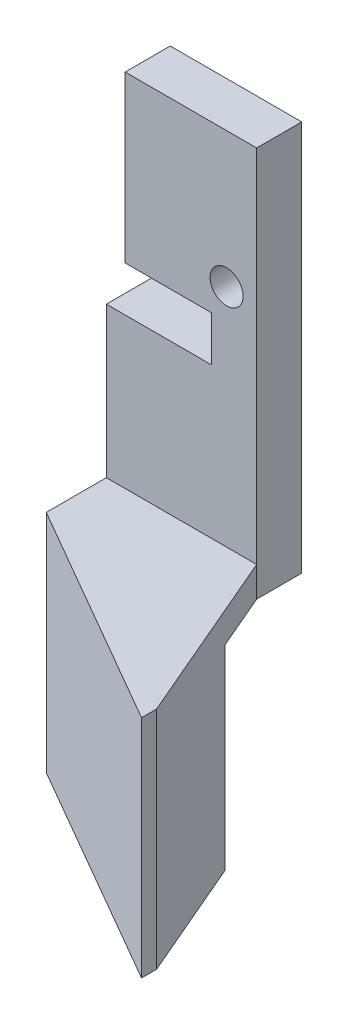
ISO-10303-21;
HEADER;
FILE_DESCRIPTION(('STEP AP214'),'2;1');
FILE_NAME('part.step','',(''),(''),'','','');
FILE_SCHEMA(('AUTOMOTIVE_DESIGN { 1 0 10303 214 1 1 1 1 }'));
ENDSEC;
DATA;
#1=APPLICATION_CONTEXT('core data for automotive mechanical design processes');
#2=APPLICATION_PROTOCOL_DEFINITION('international standard','automotive_design',2000,#1);
#3=PRODUCT_CONTEXT('',#1,'mechanical');
#4=PRODUCT('Part','Part','',(#3));
#5=PRODUCT_RELATED_PRODUCT_CATEGORY('part','',(#4));
#6=PRODUCT_DEFINITION_FORMATION('','',#4);
#7=PRODUCT_DEFINITION_CONTEXT('part definition',#1,'design');
#8=PRODUCT_DEFINITION('design','',#6,#7);
#9=PRODUCT_DEFINITION_SHAPE('','',#8);
#10=(LENGTH_UNIT() NAMED_UNIT(*) SI_UNIT(.MILLI.,.METRE.));
#11=(NAMED_UNIT(*) PLANE_ANGLE_UNIT() SI_UNIT($,.RADIAN.));
#12=(NAMED_UNIT(*) SI_UNIT($,.STERADIAN.) SOLID_ANGLE_UNIT());
#13=UNCERTAINTY_MEASURE_WITH_UNIT(LENGTH_MEASURE(1.E-05),#10,'distance_accuracy_value','');
#14=(GEOMETRIC_REPRESENTATION_CONTEXT(3) GLOBAL_UNCERTAINTY_ASSIGNED_CONTEXT((#13)) GLOBAL_UNIT_ASSIGNED_CONTEXT((#10,
#11,#12)) REPRESENTATION_CONTEXT('',''));
#15=CARTESIAN_POINT('',(0.,0.,0.));
#16=DIRECTION('',(0.,0.,1.));
#17=DIRECTION('',(1.,0.,0.));
#18=AXIS2_PLACEMENT_3D('',#15,#16,#17);
#19=CARTESIAN_POINT('',(4.875,0.,3.));
#20=DIRECTION('',(-1.,0.,0.));
#21=DIRECTION('',(0.,0.,1.));
#22=AXIS2_PLACEMENT_3D('',#19,#20,#21);
#23=PLANE('',#22);
#24=DIRECTION('',(0.,0.,1.));
#25=VECTOR('',#24,1.);
#26=CARTESIAN_POINT('',(4.875,-19.,0.));
#27=LINE('',#26,#25);
#28=CARTESIAN_POINT('',(4.875,-19.,0.));
#29=VERTEX_POINT('',#28);
#30=CARTESIAN_POINT('',(4.875,-19.,3.));
#31=VERTEX_POINT('',#30);
#32=EDGE_CURVE('E50',#29,#31,#27,.T.);
#33=ORIENTED_EDGE('',*,*,#32,.F.);
#34=DIRECTION('',(0.,1.,0.));
#35=VECTOR('',#34,1.);
#36=CARTESIAN_POINT('',(4.875,0.,0.));
#37=LINE('',#36,#35);
#38=CARTESIAN_POINT('',(4.875,7.,0.));
#39=VERTEX_POINT('',#38);
#40=EDGE_CURVE('E154',#29,#39,#37,.T.);
#41=ORIENTED_EDGE('',*,*,#40,.T.);
#42=DIRECTION('',(0.,0.,-1.));
#43=VECTOR('',#42,1.);
#44=CARTESIAN_POINT('',(4.875,7.,3.));
#45=LINE('',#44,#43);
#46=CARTESIAN_POINT('',(4.875,7.,3.));
#47=VERTEX_POINT('',#46);
#48=EDGE_CURVE('E211',#47,#39,#45,.T.);
#49=ORIENTED_EDGE('',*,*,#48,.F.);
#50=DIRECTION('',(0.,1.,0.));
#51=VECTOR('',#50,1.);
#52=CARTESIAN_POINT('',(4.875,0.,3.));
#53=LINE('',#52,#51);
#54=CARTESIAN_POINT('',(4.875,-17.,3.));
#55=VERTEX_POINT('',#54);
#56=EDGE_CURVE('E185',#55,#47,#53,.T.);
#57=ORIENTED_EDGE('',*,*,#56,.F.);
#58=DIRECTION('',(0.,1.,0.));
#59=VECTOR('',#58,1.);
#60=CARTESIAN_POINT('',(4.875,-32.,3.));
#61=LINE('',#60,#59);
#62=EDGE_CURVE('E235',#31,#55,#61,.T.);
#63=ORIENTED_EDGE('',*,*,#62,.F.);
#64=EDGE_LOOP('',(#33,#41,#49,#57,#63));
#65=FACE_BOUND('',#64,.T.);
#66=ADVANCED_FACE('F35',(#65),#23,.F.);
#67=CARTESIAN_POINT('',(0.,0.,0.));
#68=DIRECTION('',(0.,0.,1.));
#69=DIRECTION('',(1.,0.,0.));
#70=AXIS2_PLACEMENT_3D('',#67,#68,#69);
#71=PLANE('',#70);
#72=CARTESIAN_POINT('',(2.875,-2.,0.));
#73=DIRECTION('',(0.,0.,1.));
#74=DIRECTION('',(1.,0.,0.));
#75=AXIS2_PLACEMENT_3D('',#72,#73,#74);
#76=CIRCLE('',#75,1.1);
#77=CARTESIAN_POINT('',(3.975,-2.,0.));
#78=VERTEX_POINT('',#77);
#79=EDGE_CURVE('E173',#78,#78,#76,.T.);
#80=ORIENTED_EDGE('',*,*,#79,.T.);
#81=EDGE_LOOP('',(#80));
#82=FACE_BOUND('',#81,.T.);
#83=DIRECTION('',(1.,0.,0.));
#84=VECTOR('',#83,1.);
#85=CARTESIAN_POINT('',(0.,-19.,0.));
#86=LINE('',#85,#84);
#87=CARTESIAN_POINT('',(-5.125,-19.,0.));
#88=VERTEX_POINT('',#87);
#89=EDGE_CURVE('E144',#88,#29,#86,.T.);
#90=ORIENTED_EDGE('',*,*,#89,.F.);
#91=DIRECTION('',(0.,-1.,0.));
#92=VECTOR('',#91,1.);
#93=CARTESIAN_POINT('',(-5.125,-7.,0.));
#94=LINE('',#93,#92);
#95=CARTESIAN_POINT('',(-5.125,-7.,0.));
#96=VERTEX_POINT('',#95);
#97=EDGE_CURVE('E152',#96,#88,#94,.T.);
#98=ORIENTED_EDGE('',*,*,#97,.F.);
#99=DIRECTION('',(-1.,0.,0.));
#100=VECTOR('',#99,1.);
#101=CARTESIAN_POINT('',(4.875,-7.,0.));
#102=LINE('',#101,#100);
#103=CARTESIAN_POINT('',(1.875,-7.,0.));
#104=VERTEX_POINT('',#103);
#105=EDGE_CURVE('E161',#104,#96,#102,.T.);
#106=ORIENTED_EDGE('',*,*,#105,.F.);
#107=DIRECTION('',(0.,1.,0.));
#108=VECTOR('',#107,1.);
#109=CARTESIAN_POINT('',(1.875,0.,0.));
#110=LINE('',#109,#108);
#111=CARTESIAN_POINT('',(1.875,-4.,0.));
#112=VERTEX_POINT('',#111);
#113=EDGE_CURVE('E198',#104,#112,#110,.T.);
#114=ORIENTED_EDGE('',*,*,#113,.T.);
#115=DIRECTION('',(-1.,0.,0.));
#116=VECTOR('',#115,1.);
#117=CARTESIAN_POINT('',(0.,-4.,0.));
#118=LINE('',#117,#116);
#119=CARTESIAN_POINT('',(-3.875,-4.,0.));
#120=VERTEX_POINT('',#119);
#121=EDGE_CURVE('E195',#112,#120,#118,.T.);
#122=ORIENTED_EDGE('',*,*,#121,.T.);
#123=DIRECTION('',(0.,-1.,0.));
#124=VECTOR('',#123,1.);
#125=CARTESIAN_POINT('',(-3.875,0.,0.));
#126=LINE('',#125,#124);
#127=CARTESIAN_POINT('',(-3.875,7.,0.));
#128=VERTEX_POINT('',#127);
#129=EDGE_CURVE('E179',#128,#120,#126,.T.);
#130=ORIENTED_EDGE('',*,*,#129,.F.);
#131=DIRECTION('',(-1.,0.,0.));
#132=VECTOR('',#131,1.);
#133=CARTESIAN_POINT('',(0.,7.,0.));
#134=LINE('',#133,#132);
#135=EDGE_CURVE('E202',#39,#128,#134,.T.);
#136=ORIENTED_EDGE('',*,*,#135,.F.);
#137=ORIENTED_EDGE('',*,*,#40,.F.);
#138=EDGE_LOOP('',(#90,#98,#106,#114,#122,#130,#136,#137));
#139=FACE_BOUND('',#138,.T.);
#140=ADVANCED_FACE('F150',(#82,#139),#71,.F.);
#141=CARTESIAN_POINT('',(4.875,-32.,0.));
#142=DIRECTION('',(0.,-1.,0.));
#143=DIRECTION('',(0.,0.,-1.));
#144=AXIS2_PLACEMENT_3D('',#141,#142,#143);
#145=PLANE('',#144);
#146=DIRECTION('',(0.,0.,1.));
#147=VECTOR('',#146,1.);
#148=CARTESIAN_POINT('',(-5.125,-32.,0.));
#149=LINE('',#148,#147);
#150=CARTESIAN_POINT('',(-5.125,-32.,0.));
#151=VERTEX_POINT('',#150);
#152=CARTESIAN_POINT('',(-5.125,-32.,7.));
#153=VERTEX_POINT('',#152);
#154=EDGE_CURVE('E163',#151,#153,#149,.T.);
#155=ORIENTED_EDGE('',*,*,#154,.F.);
#156=DIRECTION('',(0.866025403784439,0.,0.5));
#157=VECTOR('',#156,1.);
#158=CARTESIAN_POINT('',(-1.28125,-32.,2.21919009719762));
#159=LINE('',#158,#157);
#160=CARTESIAN_POINT('',(6.45561311957995,-32.,6.68607010197039));
#161=VERTEX_POINT('',#160);
#162=EDGE_CURVE('E135',#151,#161,#159,.T.);
#163=ORIENTED_EDGE('',*,*,#162,.T.);
#164=DIRECTION('',(0.394102297208198,0.,0.91906658046913));
#165=VECTOR('',#164,1.);
#166=CARTESIAN_POINT('',(9.875,-32.,14.6602540378444));
#167=LINE('',#166,#165);
#168=CARTESIAN_POINT('',(9.875,-32.,14.6602540378444));
#169=VERTEX_POINT('',#168);
#170=EDGE_CURVE('E241',#161,#169,#167,.T.);
#171=ORIENTED_EDGE('',*,*,#170,.T.);
#172=DIRECTION('',(0.,0.,1.));
#173=VECTOR('',#172,1.);
#174=CARTESIAN_POINT('',(9.875,-32.,0.));
#175=LINE('',#174,#173);
#176=CARTESIAN_POINT('',(9.875,-32.,15.6602540378444));
#177=VERTEX_POINT('',#176);
#178=EDGE_CURVE('E246',#169,#177,#175,.T.);
#179=ORIENTED_EDGE('',*,*,#178,.T.);
#180=DIRECTION('',(0.866025403784438,0.,0.500000000000001));
#181=VECTOR('',#180,1.);
#182=CARTESIAN_POINT('',(-4.31233891324555,-32.,7.46919009719762));
#183=LINE('',#182,#181);
#184=EDGE_CURVE('E251',#153,#177,#183,.T.);
#185=ORIENTED_EDGE('',*,*,#184,.F.);
#186=EDGE_LOOP('',(#155,#163,#171,#179,#185));
#187=FACE_BOUND('',#186,.T.);
#188=ADVANCED_FACE('F284',(#187),#145,.T.);
#189=CARTESIAN_POINT('',(9.875,-32.,14.6602540378444));
#190=DIRECTION('',(-0.919066580469131,0.,0.394102297208198));
#191=DIRECTION('',(0.394102297208198,0.,0.919066580469131));
#192=AXIS2_PLACEMENT_3D('',#189,#190,#191);
#193=PLANE('',#192);
#194=DIRECTION('',(0.,-1.,0.));
#195=VECTOR('',#194,1.);
#196=CARTESIAN_POINT('',(6.45561311957995,-19.,6.68607010197039));
#197=LINE('',#196,#195);
#198=CARTESIAN_POINT('',(6.45561311957995,-19.,6.68607010197039));
#199=VERTEX_POINT('',#198);
#200=EDGE_CURVE('E139',#199,#161,#197,.T.);
#201=ORIENTED_EDGE('',*,*,#200,.F.);
#202=DIRECTION('',(0.394102297208199,0.,0.919066580469131));
#203=VECTOR('',#202,1.);
#204=CARTESIAN_POINT('',(3.0312127223087,-19.,-1.29980560992523));
#205=LINE('',#204,#203);
#206=EDGE_CURVE('E140',#31,#199,#205,.T.);
#207=ORIENTED_EDGE('',*,*,#206,.F.);
#208=ORIENTED_EDGE('',*,*,#62,.T.);
#209=DIRECTION('',(0.394102297208198,0.,0.91906658046913));
#210=VECTOR('',#209,1.);
#211=CARTESIAN_POINT('',(9.875,-17.,14.6602540378444));
#212=LINE('',#211,#210);
#213=CARTESIAN_POINT('',(9.875,-17.,14.6602540378444));
#214=VERTEX_POINT('',#213);
#215=EDGE_CURVE('E58',#55,#214,#212,.T.);
#216=ORIENTED_EDGE('',*,*,#215,.T.);
#217=DIRECTION('',(0.,1.,0.));
#218=VECTOR('',#217,1.);
#219=CARTESIAN_POINT('',(9.875,-32.,14.6602540378444));
#220=LINE('',#219,#218);
#221=EDGE_CURVE('E244',#169,#214,#220,.T.);
#222=ORIENTED_EDGE('',*,*,#221,.F.);
#223=ORIENTED_EDGE('',*,*,#170,.F.);
#224=EDGE_LOOP('',(#201,#207,#208,#216,#222,#223));
#225=FACE_BOUND('',#224,.T.);
#226=ADVANCED_FACE('F282',(#225),#193,.F.);
#227=CARTESIAN_POINT('',(0.,0.,3.));
#228=DIRECTION('',(0.,0.,1.));
#229=DIRECTION('',(1.,0.,0.));
#230=AXIS2_PLACEMENT_3D('',#227,#228,#229);
#231=PLANE('',#230);
#232=CARTESIAN_POINT('',(2.875,-2.,3.));
#233=DIRECTION('',(0.,0.,1.));
#234=DIRECTION('',(1.,0.,0.));
#235=AXIS2_PLACEMENT_3D('',#232,#233,#234);
#236=CIRCLE('',#235,1.1);
#237=CARTESIAN_POINT('',(3.975,-2.,3.));
#238=VERTEX_POINT('',#237);
#239=EDGE_CURVE('E175',#238,#238,#236,.T.);
#240=ORIENTED_EDGE('',*,*,#239,.F.);
#241=EDGE_LOOP('',(#240));
#242=FACE_BOUND('',#241,.T.);
#243=DIRECTION('',(0.,-1.,0.));
#244=VECTOR('',#243,1.);
#245=CARTESIAN_POINT('',(-5.125,-7.,3.));
#246=LINE('',#245,#244);
#247=CARTESIAN_POINT('',(-5.125,-7.,3.));
#248=VERTEX_POINT('',#247);
#249=CARTESIAN_POINT('',(-5.125,-17.,3.));
#250=VERTEX_POINT('',#249);
#251=EDGE_CURVE('E165',#248,#250,#246,.T.);
#252=ORIENTED_EDGE('',*,*,#251,.T.);
#253=DIRECTION('',(1.,0.,0.));
#254=VECTOR('',#253,1.);
#255=CARTESIAN_POINT('',(0.,-17.,3.));
#256=LINE('',#255,#254);
#257=EDGE_CURVE('E171',#250,#55,#256,.T.);
#258=ORIENTED_EDGE('',*,*,#257,.T.);
#259=ORIENTED_EDGE('',*,*,#56,.T.);
#260=DIRECTION('',(-1.,0.,0.));
#261=VECTOR('',#260,1.);
#262=CARTESIAN_POINT('',(0.,7.,3.));
#263=LINE('',#262,#261);
#264=CARTESIAN_POINT('',(-3.875,7.,3.));
#265=VERTEX_POINT('',#264);
#266=EDGE_CURVE('E187',#47,#265,#263,.T.);
#267=ORIENTED_EDGE('',*,*,#266,.T.);
#268=DIRECTION('',(0.,-1.,0.));
#269=VECTOR('',#268,1.);
#270=CARTESIAN_POINT('',(-3.875,0.,3.));
#271=LINE('',#270,#269);
#272=CARTESIAN_POINT('',(-3.875,-4.,3.));
#273=VERTEX_POINT('',#272);
#274=EDGE_CURVE('E190',#265,#273,#271,.T.);
#275=ORIENTED_EDGE('',*,*,#274,.T.);
#276=DIRECTION('',(-1.,0.,0.));
#277=VECTOR('',#276,1.);
#278=CARTESIAN_POINT('',(0.,-4.,3.));
#279=LINE('',#278,#277);
#280=CARTESIAN_POINT('',(1.875,-4.,3.));
#281=VERTEX_POINT('',#280);
#282=EDGE_CURVE('E178',#281,#273,#279,.T.);
#283=ORIENTED_EDGE('',*,*,#282,.F.);
#284=DIRECTION('',(0.,1.,0.));
#285=VECTOR('',#284,1.);
#286=CARTESIAN_POINT('',(1.875,0.,3.));
#287=LINE('',#286,#285);
#288=CARTESIAN_POINT('',(1.875,-7.,3.));
#289=VERTEX_POINT('',#288);
#290=EDGE_CURVE('E182',#289,#281,#287,.T.);
#291=ORIENTED_EDGE('',*,*,#290,.F.);
#292=DIRECTION('',(-1.,0.,0.));
#293=VECTOR('',#292,1.);
#294=CARTESIAN_POINT('',(4.875,-7.,3.));
#295=LINE('',#294,#293);
#296=EDGE_CURVE('E169',#289,#248,#295,.T.);
#297=ORIENTED_EDGE('',*,*,#296,.T.);
#298=EDGE_LOOP('',(#252,#258,#259,#267,#275,#283,#291,#297));
#299=FACE_BOUND('',#298,.T.);
#300=ADVANCED_FACE('F267',(#242,#299),#231,.T.);
#301=CARTESIAN_POINT('',(0.,-4.,3.));
#302=DIRECTION('',(0.,-1.,0.));
#303=DIRECTION('',(1.,0.,0.));
#304=AXIS2_PLACEMENT_3D('',#301,#302,#303);
#305=PLANE('',#304);
#306=ORIENTED_EDGE('',*,*,#121,.F.);
#307=DIRECTION('',(0.,0.,-1.));
#308=VECTOR('',#307,1.);
#309=CARTESIAN_POINT('',(1.875,-4.,3.));
#310=LINE('',#309,#308);
#311=EDGE_CURVE('E11',#281,#112,#310,.T.);
#312=ORIENTED_EDGE('',*,*,#311,.F.);
#313=ORIENTED_EDGE('',*,*,#282,.T.);
#314=DIRECTION('',(0.,0.,-1.));
#315=VECTOR('',#314,1.);
#316=CARTESIAN_POINT('',(-3.875,-4.,3.));
#317=LINE('',#316,#315);
#318=EDGE_CURVE('E192',#273,#120,#317,.T.);
#319=ORIENTED_EDGE('',*,*,#318,.T.);
#320=EDGE_LOOP('',(#306,#312,#313,#319));
#321=FACE_BOUND('',#320,.T.);
#322=ADVANCED_FACE('F223',(#321),#305,.T.);
#323=CARTESIAN_POINT('',(1.875,0.,3.));
#324=DIRECTION('',(-1.,0.,0.));
#325=DIRECTION('',(0.,0.,1.));
#326=AXIS2_PLACEMENT_3D('',#323,#324,#325);
#327=PLANE('',#326);
#328=ORIENTED_EDGE('',*,*,#113,.F.);
#329=DIRECTION('',(0.,0.,-1.));
#330=VECTOR('',#329,1.);
#331=CARTESIAN_POINT('',(1.875,-7.,3.));
#332=LINE('',#331,#330);
#333=EDGE_CURVE('E43',#289,#104,#332,.T.);
#334=ORIENTED_EDGE('',*,*,#333,.F.);
#335=ORIENTED_EDGE('',*,*,#290,.T.);
#336=ORIENTED_EDGE('',*,*,#311,.T.);
#337=EDGE_LOOP('',(#328,#334,#335,#336));
#338=FACE_BOUND('',#337,.T.);
#339=ADVANCED_FACE('F220',(#338),#327,.T.);
#340=CARTESIAN_POINT('',(0.,7.,3.));
#341=DIRECTION('',(0.,-1.,0.));
#342=DIRECTION('',(1.,0.,0.));
#343=AXIS2_PLACEMENT_3D('',#340,#341,#342);
#344=PLANE('',#343);
#345=ORIENTED_EDGE('',*,*,#135,.T.);
#346=DIRECTION('',(0.,0.,-1.));
#347=VECTOR('',#346,1.);
#348=CARTESIAN_POINT('',(-3.875,7.,3.));
#349=LINE('',#348,#347);
#350=EDGE_CURVE('E208',#265,#128,#349,.T.);
#351=ORIENTED_EDGE('',*,*,#350,.F.);
#352=ORIENTED_EDGE('',*,*,#266,.F.);
#353=ORIENTED_EDGE('',*,*,#48,.T.);
#354=EDGE_LOOP('',(#345,#351,#352,#353));
#355=FACE_BOUND('',#354,.T.);
#356=ADVANCED_FACE('F231',(#355),#344,.F.);
#357=CARTESIAN_POINT('',(2.875,-2.,3.));
#358=DIRECTION('',(0.,0.,-1.));
#359=DIRECTION('',(-1.,0.,0.));
#360=AXIS2_PLACEMENT_3D('',#357,#358,#359);
#361=CYLINDRICAL_SURFACE('',#360,1.1);
#362=ORIENTED_EDGE('',*,*,#239,.T.);
#363=EDGE_LOOP('',(#362));
#364=FACE_BOUND('',#363,.T.);
#365=ORIENTED_EDGE('',*,*,#79,.F.);
#366=EDGE_LOOP('',(#365));
#367=FACE_BOUND('',#366,.T.);
#368=ADVANCED_FACE('F37',(#364,#367),#361,.F.);
#369=CARTESIAN_POINT('',(-3.875,0.,3.));
#370=DIRECTION('',(1.,0.,0.));
#371=DIRECTION('',(0.,1.,0.));
#372=AXIS2_PLACEMENT_3D('',#369,#370,#371);
#373=PLANE('',#372);
#374=ORIENTED_EDGE('',*,*,#129,.T.);
#375=ORIENTED_EDGE('',*,*,#318,.F.);
#376=ORIENTED_EDGE('',*,*,#274,.F.);
#377=ORIENTED_EDGE('',*,*,#350,.T.);
#378=EDGE_LOOP('',(#374,#375,#376,#377));
#379=FACE_BOUND('',#378,.T.);
#380=ADVANCED_FACE('F226',(#379),#373,.F.);
#381=CARTESIAN_POINT('',(-5.125,-7.,0.));
#382=DIRECTION('',(-1.,0.,0.));
#383=DIRECTION('',(0.,-1.,0.));
#384=AXIS2_PLACEMENT_3D('',#381,#382,#383);
#385=PLANE('',#384);
#386=ORIENTED_EDGE('',*,*,#154,.T.);
#387=DIRECTION('',(0.,-1.,0.));
#388=VECTOR('',#387,1.);
#389=CARTESIAN_POINT('',(-5.125,-17.,7.));
#390=LINE('',#389,#388);
#391=CARTESIAN_POINT('',(-5.125,-17.,7.));
#392=VERTEX_POINT('',#391);
#393=EDGE_CURVE('E260',#392,#153,#390,.T.);
#394=ORIENTED_EDGE('',*,*,#393,.F.);
#395=DIRECTION('',(0.,0.,1.));
#396=VECTOR('',#395,1.);
#397=CARTESIAN_POINT('',(-5.125,-17.,0.));
#398=LINE('',#397,#396);
#399=EDGE_CURVE('E248',#250,#392,#398,.T.);
#400=ORIENTED_EDGE('',*,*,#399,.F.);
#401=ORIENTED_EDGE('',*,*,#251,.F.);
#402=DIRECTION('',(0.,0.,1.));
#403=VECTOR('',#402,1.);
#404=CARTESIAN_POINT('',(-5.125,-7.,0.));
#405=LINE('',#404,#403);
#406=EDGE_CURVE('E160',#96,#248,#405,.T.);
#407=ORIENTED_EDGE('',*,*,#406,.F.);
#408=ORIENTED_EDGE('',*,*,#97,.T.);
#409=DIRECTION('',(0.,-1.,0.));
#410=VECTOR('',#409,1.);
#411=CARTESIAN_POINT('',(-5.125,-19.,0.));
#412=LINE('',#411,#410);
#413=EDGE_CURVE('E130',#88,#151,#412,.T.);
#414=ORIENTED_EDGE('',*,*,#413,.T.);
#415=EDGE_LOOP('',(#386,#394,#400,#401,#407,#408,#414));
#416=FACE_BOUND('',#415,.T.);
#417=ADVANCED_FACE('F157',(#416),#385,.T.);
#418=CARTESIAN_POINT('',(4.875,-7.,0.));
#419=DIRECTION('',(0.,1.,0.));
#420=DIRECTION('',(-1.,0.,0.));
#421=AXIS2_PLACEMENT_3D('',#418,#419,#420);
#422=PLANE('',#421);
#423=ORIENTED_EDGE('',*,*,#296,.F.);
#424=ORIENTED_EDGE('',*,*,#333,.T.);
#425=ORIENTED_EDGE('',*,*,#105,.T.);
#426=ORIENTED_EDGE('',*,*,#406,.T.);
#427=EDGE_LOOP('',(#423,#424,#425,#426));
#428=FACE_BOUND('',#427,.T.);
#429=ADVANCED_FACE('F216',(#428),#422,.T.);
#430=CARTESIAN_POINT('',(0.,-17.,0.));
#431=DIRECTION('',(0.,-1.,0.));
#432=DIRECTION('',(0.,0.,-1.));
#433=AXIS2_PLACEMENT_3D('',#430,#431,#432);
#434=PLANE('',#433);
#435=DIRECTION('',(0.,0.,1.));
#436=VECTOR('',#435,1.);
#437=CARTESIAN_POINT('',(9.875,-17.,0.));
#438=LINE('',#437,#436);
#439=CARTESIAN_POINT('',(9.875,-17.,15.6602540378444));
#440=VERTEX_POINT('',#439);
#441=EDGE_CURVE('E250',#214,#440,#438,.T.);
#442=ORIENTED_EDGE('',*,*,#441,.F.);
#443=ORIENTED_EDGE('',*,*,#215,.F.);
#444=ORIENTED_EDGE('',*,*,#257,.F.);
#445=ORIENTED_EDGE('',*,*,#399,.T.);
#446=DIRECTION('',(0.866025403784438,0.,0.500000000000001));
#447=VECTOR('',#446,1.);
#448=CARTESIAN_POINT('',(-4.31233891324555,-17.,7.46919009719762));
#449=LINE('',#448,#447);
#450=EDGE_CURVE('E253',#392,#440,#449,.T.);
#451=ORIENTED_EDGE('',*,*,#450,.T.);
#452=EDGE_LOOP('',(#442,#443,#444,#445,#451));
#453=FACE_BOUND('',#452,.T.);
#454=ADVANCED_FACE('F271',(#453),#434,.F.);
#455=CARTESIAN_POINT('',(-4.31233891324555,-17.,7.46919009719762));
#456=DIRECTION('',(0.500000000000001,0.,-0.866025403784438));
#457=DIRECTION('',(-0.866025403784438,0.,-0.500000000000001));
#458=AXIS2_PLACEMENT_3D('',#455,#456,#457);
#459=PLANE('',#458);
#460=ORIENTED_EDGE('',*,*,#184,.T.);
#461=DIRECTION('',(0.,-1.,0.));
#462=VECTOR('',#461,1.);
#463=CARTESIAN_POINT('',(9.875,-17.,15.6602540378444));
#464=LINE('',#463,#462);
#465=EDGE_CURVE('E256',#440,#177,#464,.T.);
#466=ORIENTED_EDGE('',*,*,#465,.F.);
#467=ORIENTED_EDGE('',*,*,#450,.F.);
#468=ORIENTED_EDGE('',*,*,#393,.T.);
#469=EDGE_LOOP('',(#460,#466,#467,#468));
#470=FACE_BOUND('',#469,.T.);
#471=ADVANCED_FACE('F276',(#470),#459,.F.);
#472=CARTESIAN_POINT('',(9.875,-17.,0.));
#473=DIRECTION('',(1.,0.,0.));
#474=DIRECTION('',(0.,0.,-1.));
#475=AXIS2_PLACEMENT_3D('',#472,#473,#474);
#476=PLANE('',#475);
#477=ORIENTED_EDGE('',*,*,#221,.T.);
#478=ORIENTED_EDGE('',*,*,#441,.T.);
#479=ORIENTED_EDGE('',*,*,#465,.T.);
#480=ORIENTED_EDGE('',*,*,#178,.F.);
#481=EDGE_LOOP('',(#477,#478,#479,#480));
#482=FACE_BOUND('',#481,.T.);
#483=ADVANCED_FACE('F279',(#482),#476,.T.);
#484=CARTESIAN_POINT('',(-1.28125,-19.,2.21919009719762));
#485=DIRECTION('',(0.5,0.,-0.866025403784439));
#486=DIRECTION('',(-0.866025403784439,0.,-0.5));
#487=AXIS2_PLACEMENT_3D('',#484,#485,#486);
#488=PLANE('',#487);
#489=ORIENTED_EDGE('',*,*,#162,.F.);
#490=ORIENTED_EDGE('',*,*,#413,.F.);
#491=DIRECTION('',(0.866025403784439,0.,0.5));
#492=VECTOR('',#491,1.);
#493=CARTESIAN_POINT('',(-1.28125,-19.,2.21919009719762));
#494=LINE('',#493,#492);
#495=EDGE_CURVE('E133',#88,#199,#494,.T.);
#496=ORIENTED_EDGE('',*,*,#495,.T.);
#497=ORIENTED_EDGE('',*,*,#200,.T.);
#498=EDGE_LOOP('',(#489,#490,#496,#497));
#499=FACE_BOUND('',#498,.T.);
#500=ADVANCED_FACE('F132',(#499),#488,.T.);
#501=CARTESIAN_POINT('',(0.,-19.,0.));
#502=DIRECTION('',(0.,-1.,0.));
#503=DIRECTION('',(0.,0.,-1.));
#504=AXIS2_PLACEMENT_3D('',#501,#502,#503);
#505=PLANE('',#504);
#506=ORIENTED_EDGE('',*,*,#495,.F.);
#507=ORIENTED_EDGE('',*,*,#89,.T.);
#508=ORIENTED_EDGE('',*,*,#32,.T.);
#509=ORIENTED_EDGE('',*,*,#206,.T.);
#510=EDGE_LOOP('',(#506,#507,#508,#509));
#511=FACE_BOUND('',#510,.T.);
#512=ADVANCED_FACE('F143',(#511),#505,.T.);
#513=CLOSED_SHELL('',(#66,#140,#188,#226,#300,#322,#339,#356,#368,#380,#417,#429,#454,#471,#483,
#500,#512));
#514=MANIFOLD_SOLID_BREP('B2',#513);
#515=ADVANCED_BREP_SHAPE_REPRESENTATION('',(#18,#514),#14);
#516=SHAPE_DEFINITION_REPRESENTATION(#9,#515);
ENDSEC;
END-ISO-10303-21;
